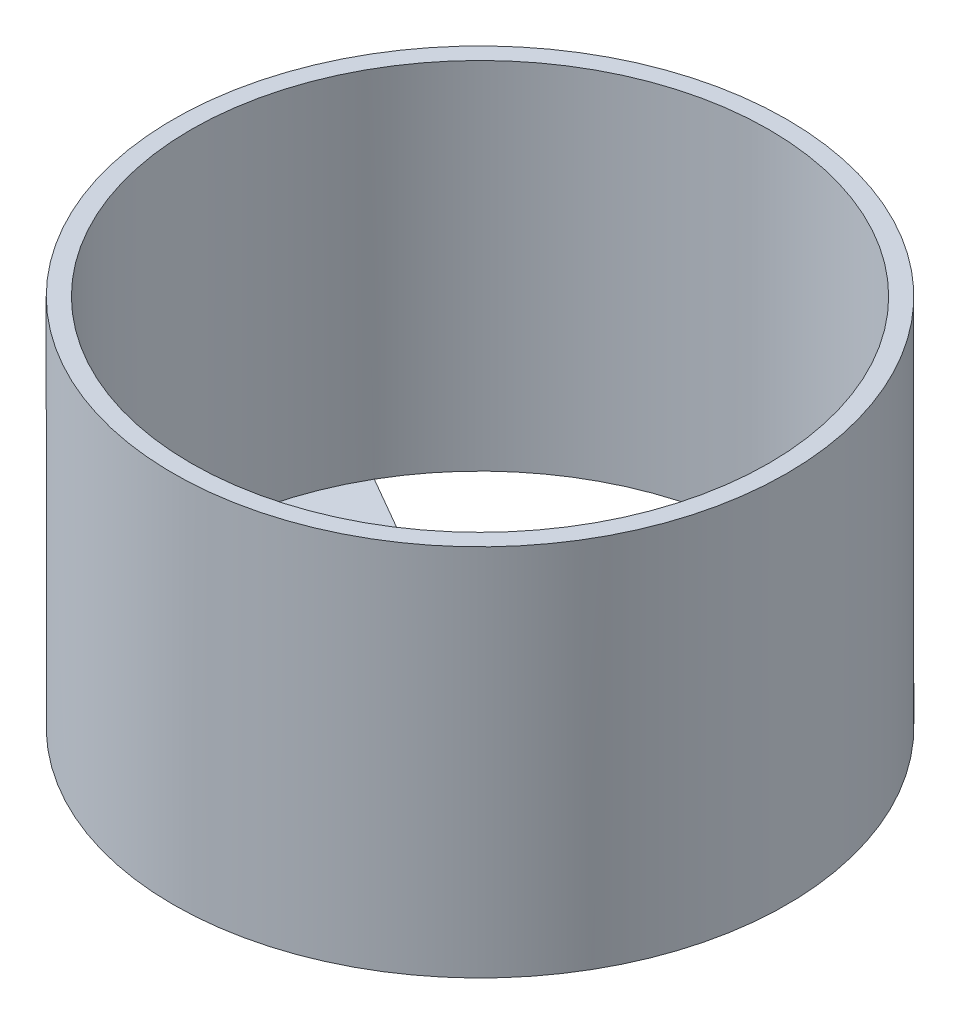
ISO-10303-21;
HEADER;
FILE_DESCRIPTION(('STEP AP214'),'2;1');
FILE_NAME('part.step','',(''),(''),'','','');
FILE_SCHEMA(('AUTOMOTIVE_DESIGN { 1 0 10303 214 1 1 1 1 }'));
ENDSEC;
DATA;
#1=APPLICATION_CONTEXT('core data for automotive mechanical design processes');
#2=APPLICATION_PROTOCOL_DEFINITION('international standard','automotive_design',2000,#1);
#3=PRODUCT_CONTEXT('',#1,'mechanical');
#4=PRODUCT('Part','Part','',(#3));
#5=PRODUCT_RELATED_PRODUCT_CATEGORY('part','',(#4));
#6=PRODUCT_DEFINITION_FORMATION('','',#4);
#7=PRODUCT_DEFINITION_CONTEXT('part definition',#1,'design');
#8=PRODUCT_DEFINITION('design','',#6,#7);
#9=PRODUCT_DEFINITION_SHAPE('','',#8);
#10=(LENGTH_UNIT() NAMED_UNIT(*) SI_UNIT(.MILLI.,.METRE.));
#11=(NAMED_UNIT(*) PLANE_ANGLE_UNIT() SI_UNIT($,.RADIAN.));
#12=(NAMED_UNIT(*) SI_UNIT($,.STERADIAN.) SOLID_ANGLE_UNIT());
#13=UNCERTAINTY_MEASURE_WITH_UNIT(LENGTH_MEASURE(1.E-05),#10,'distance_accuracy_value','');
#14=(GEOMETRIC_REPRESENTATION_CONTEXT(3) GLOBAL_UNCERTAINTY_ASSIGNED_CONTEXT((#13)) GLOBAL_UNIT_ASSIGNED_CONTEXT((#10,
#11,#12)) REPRESENTATION_CONTEXT('',''));
#15=CARTESIAN_POINT('',(0.,0.,0.));
#16=DIRECTION('',(0.,0.,1.));
#17=DIRECTION('',(1.,0.,0.));
#18=AXIS2_PLACEMENT_3D('',#15,#16,#17);
#19=CARTESIAN_POINT('',(0.,0.,0.));
#20=DIRECTION('',(0.,1.,0.));
#21=DIRECTION('',(0.,0.,1.));
#22=AXIS2_PLACEMENT_3D('',#19,#20,#21);
#23=PLANE('',#22);
#24=DIRECTION('',(0.866025403784436,0.,0.500000000000004));
#25=VECTOR('',#24,1.);
#26=CARTESIAN_POINT('',(0.,0.,0.));
#27=LINE('',#26,#25);
#28=CARTESIAN_POINT('',(-37.9449030668151,0.,-21.9075000000002));
#29=VERTEX_POINT('',#28);
#30=CARTESIAN_POINT('',(-35.7451985412026,0.,-20.6375000000002));
#31=VERTEX_POINT('',#30);
#32=EDGE_CURVE('E126',#29,#31,#27,.T.);
#33=ORIENTED_EDGE('',*,*,#32,.F.);
#34=CARTESIAN_POINT('',(0.,0.,0.));
#35=DIRECTION('',(0.,1.,0.));
#36=DIRECTION('',(1.,0.,0.));
#37=AXIS2_PLACEMENT_3D('',#34,#35,#36);
#38=CIRCLE('',#37,43.815);
#39=CARTESIAN_POINT('',(0.,0.,-43.815));
#40=VERTEX_POINT('',#39);
#41=EDGE_CURVE('E116',#40,#29,#38,.T.);
#42=ORIENTED_EDGE('',*,*,#41,.F.);
#43=DIRECTION('',(0.,0.,-1.));
#44=VECTOR('',#43,1.);
#45=CARTESIAN_POINT('',(0.,0.,-43.815));
#46=LINE('',#45,#44);
#47=CARTESIAN_POINT('',(0.,0.,-41.275));
#48=VERTEX_POINT('',#47);
#49=EDGE_CURVE('E12',#48,#40,#46,.T.);
#50=ORIENTED_EDGE('',*,*,#49,.F.);
#51=CARTESIAN_POINT('',(0.,0.,0.));
#52=DIRECTION('',(0.,1.,0.));
#53=DIRECTION('',(0.,0.,1.));
#54=AXIS2_PLACEMENT_3D('',#51,#52,#53);
#55=CIRCLE('',#54,41.275);
#56=EDGE_CURVE('E106',#48,#31,#55,.T.);
#57=ORIENTED_EDGE('',*,*,#56,.T.);
#58=EDGE_LOOP('',(#33,#42,#50,#57));
#59=FACE_BOUND('',#58,.T.);
#60=ADVANCED_FACE('F39',(#59),#23,.F.);
#61=CARTESIAN_POINT('',(0.,50.8,0.));
#62=DIRECTION('',(0.,1.,0.));
#63=DIRECTION('',(0.,0.,1.));
#64=AXIS2_PLACEMENT_3D('',#61,#62,#63);
#65=PLANE('',#64);
#66=CARTESIAN_POINT('',(0.,50.8,0.));
#67=DIRECTION('',(0.,1.,0.));
#68=DIRECTION('',(1.,0.,0.));
#69=AXIS2_PLACEMENT_3D('',#66,#67,#68);
#70=CIRCLE('',#69,43.815);
#71=CARTESIAN_POINT('',(43.815,50.8,0.));
#72=VERTEX_POINT('',#71);
#73=EDGE_CURVE('E48',#72,#72,#70,.T.);
#74=ORIENTED_EDGE('',*,*,#73,.T.);
#75=EDGE_LOOP('',(#74));
#76=FACE_BOUND('',#75,.T.);
#77=CARTESIAN_POINT('',(0.,50.8,0.));
#78=DIRECTION('',(0.,1.,0.));
#79=DIRECTION('',(0.,0.,1.));
#80=AXIS2_PLACEMENT_3D('',#77,#78,#79);
#81=CIRCLE('',#80,41.275);
#82=CARTESIAN_POINT('',(0.,50.8,41.275));
#83=VERTEX_POINT('',#82);
#84=EDGE_CURVE('E114',#83,#83,#81,.T.);
#85=ORIENTED_EDGE('',*,*,#84,.F.);
#86=EDGE_LOOP('',(#85));
#87=FACE_BOUND('',#86,.T.);
#88=ADVANCED_FACE('F145',(#76,#87),#65,.T.);
#89=CARTESIAN_POINT('',(0.,50.8,0.));
#90=DIRECTION('',(0.,-1.,0.));
#91=DIRECTION('',(0.,0.,-1.));
#92=AXIS2_PLACEMENT_3D('',#89,#90,#91);
#93=CYLINDRICAL_SURFACE('',#92,43.815);
#94=ORIENTED_EDGE('',*,*,#73,.F.);
#95=EDGE_LOOP('',(#94));
#96=FACE_BOUND('',#95,.T.);
#97=ORIENTED_EDGE('',*,*,#41,.T.);
#98=DIRECTION('',(0.,1.,0.));
#99=VECTOR('',#98,1.);
#100=CARTESIAN_POINT('',(-37.9449030668151,-2.54,-21.9075000000002));
#101=LINE('',#100,#99);
#102=CARTESIAN_POINT('',(-37.9449030668151,-2.54,-21.9075000000002));
#103=VERTEX_POINT('',#102);
#104=EDGE_CURVE('E108',#103,#29,#101,.T.);
#105=ORIENTED_EDGE('',*,*,#104,.F.);
#106=CARTESIAN_POINT('',(0.,-2.54,0.));
#107=DIRECTION('',(0.,-1.,0.));
#108=DIRECTION('',(0.,0.,-1.));
#109=AXIS2_PLACEMENT_3D('',#106,#107,#108);
#110=CIRCLE('',#109,43.815);
#111=CARTESIAN_POINT('',(0.,-2.54,-43.815));
#112=VERTEX_POINT('',#111);
#113=EDGE_CURVE('E90',#112,#103,#110,.T.);
#114=ORIENTED_EDGE('',*,*,#113,.F.);
#115=DIRECTION('',(0.,1.,0.));
#116=VECTOR('',#115,1.);
#117=CARTESIAN_POINT('',(0.,-2.54,-43.815));
#118=LINE('',#117,#116);
#119=EDGE_CURVE('E87',#112,#40,#118,.T.);
#120=ORIENTED_EDGE('',*,*,#119,.T.);
#121=EDGE_LOOP('',(#97,#105,#114,#120));
#122=FACE_BOUND('',#121,.T.);
#123=ADVANCED_FACE('F41',(#96,#122),#93,.T.);
#124=CARTESIAN_POINT('',(0.,50.8,0.));
#125=DIRECTION('',(0.,-1.,0.));
#126=DIRECTION('',(0.,0.,-1.));
#127=AXIS2_PLACEMENT_3D('',#124,#125,#126);
#128=CYLINDRICAL_SURFACE('',#127,41.275);
#129=ORIENTED_EDGE('',*,*,#84,.T.);
#130=EDGE_LOOP('',(#129));
#131=FACE_BOUND('',#130,.T.);
#132=ORIENTED_EDGE('',*,*,#56,.F.);
#133=EDGE_CURVE('E55',#31,#48,#55,.T.);
#134=ORIENTED_EDGE('',*,*,#133,.F.);
#135=EDGE_LOOP('',(#132,#134));
#136=FACE_BOUND('',#135,.T.);
#137=ADVANCED_FACE('F133',(#131,#136),#128,.F.);
#138=CARTESIAN_POINT('',(0.,0.,0.));
#139=DIRECTION('',(0.,-1.,0.));
#140=DIRECTION('',(0.,0.,-1.));
#141=AXIS2_PLACEMENT_3D('',#138,#139,#140);
#142=PLANE('',#141);
#143=CARTESIAN_POINT('',(0.,0.,0.));
#144=VERTEX_POINT('',#143);
#145=EDGE_CURVE('E103',#31,#144,#27,.T.);
#146=ORIENTED_EDGE('',*,*,#145,.F.);
#147=ORIENTED_EDGE('',*,*,#133,.T.);
#148=EDGE_CURVE('E98',#144,#48,#46,.T.);
#149=ORIENTED_EDGE('',*,*,#148,.F.);
#150=EDGE_LOOP('',(#146,#147,#149));
#151=FACE_BOUND('',#150,.T.);
#152=ADVANCED_FACE('F131',(#151),#142,.F.);
#153=CARTESIAN_POINT('',(0.,-2.54,0.));
#154=DIRECTION('',(-0.500000000000004,0.,0.866025403784436));
#155=DIRECTION('',(0.866025403784436,0.,0.500000000000004));
#156=AXIS2_PLACEMENT_3D('',#153,#154,#155);
#157=PLANE('',#156);
#158=ORIENTED_EDGE('',*,*,#32,.T.);
#159=ORIENTED_EDGE('',*,*,#145,.T.);
#160=DIRECTION('',(0.,1.,0.));
#161=VECTOR('',#160,1.);
#162=CARTESIAN_POINT('',(0.,-2.54,0.));
#163=LINE('',#162,#161);
#164=CARTESIAN_POINT('',(0.,-2.54,0.));
#165=VERTEX_POINT('',#164);
#166=EDGE_CURVE('E85',#165,#144,#163,.T.);
#167=ORIENTED_EDGE('',*,*,#166,.F.);
#168=DIRECTION('',(0.866025403784436,0.,0.500000000000004));
#169=VECTOR('',#168,1.);
#170=CARTESIAN_POINT('',(0.,-2.54,0.));
#171=LINE('',#170,#169);
#172=EDGE_CURVE('E91',#103,#165,#171,.T.);
#173=ORIENTED_EDGE('',*,*,#172,.F.);
#174=ORIENTED_EDGE('',*,*,#104,.T.);
#175=EDGE_LOOP('',(#158,#159,#167,#173,#174));
#176=FACE_BOUND('',#175,.T.);
#177=ADVANCED_FACE('F101',(#176),#157,.F.);
#178=CARTESIAN_POINT('',(0.,-2.54,-43.815));
#179=DIRECTION('',(1.,0.,0.));
#180=DIRECTION('',(0.,0.,-1.));
#181=AXIS2_PLACEMENT_3D('',#178,#179,#180);
#182=PLANE('',#181);
#183=ORIENTED_EDGE('',*,*,#148,.T.);
#184=ORIENTED_EDGE('',*,*,#49,.T.);
#185=ORIENTED_EDGE('',*,*,#119,.F.);
#186=DIRECTION('',(0.,0.,-1.));
#187=VECTOR('',#186,1.);
#188=CARTESIAN_POINT('',(0.,-2.54,-43.815));
#189=LINE('',#188,#187);
#190=EDGE_CURVE('E80',#165,#112,#189,.T.);
#191=ORIENTED_EDGE('',*,*,#190,.F.);
#192=ORIENTED_EDGE('',*,*,#166,.T.);
#193=EDGE_LOOP('',(#183,#184,#185,#191,#192));
#194=FACE_BOUND('',#193,.T.);
#195=ADVANCED_FACE('F83',(#194),#182,.F.);
#196=CARTESIAN_POINT('',(0.,-2.54,0.));
#197=DIRECTION('',(0.,-1.,0.));
#198=DIRECTION('',(0.,0.,-1.));
#199=AXIS2_PLACEMENT_3D('',#196,#197,#198);
#200=PLANE('',#199);
#201=ORIENTED_EDGE('',*,*,#172,.T.);
#202=ORIENTED_EDGE('',*,*,#190,.T.);
#203=ORIENTED_EDGE('',*,*,#113,.T.);
#204=EDGE_LOOP('',(#201,#202,#203));
#205=FACE_BOUND('',#204,.T.);
#206=ADVANCED_FACE('F94',(#205),#200,.T.);
#207=CLOSED_SHELL('',(#60,#88,#123,#137,#152,#177,#195,#206));
#208=MANIFOLD_SOLID_BREP('B2',#207);
#209=ADVANCED_BREP_SHAPE_REPRESENTATION('',(#18,#208),#14);
#210=SHAPE_DEFINITION_REPRESENTATION(#9,#209);
ENDSEC;
END-ISO-10303-21;
